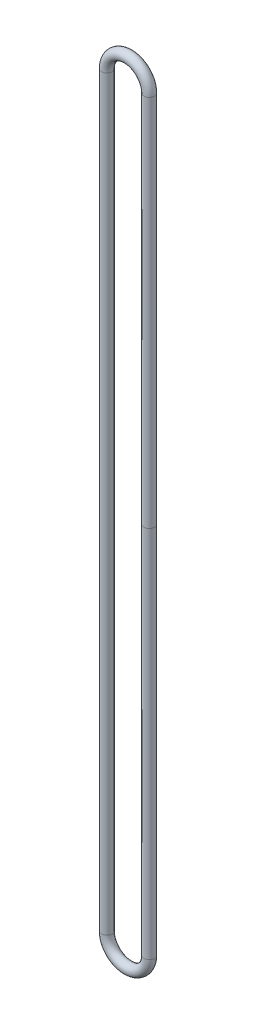
ISO-10303-21;
HEADER;
FILE_DESCRIPTION(('STEP AP214'),'2;1');
FILE_NAME('part.step','',(''),(''),'','','');
FILE_SCHEMA(('AUTOMOTIVE_DESIGN { 1 0 10303 214 1 1 1 1 }'));
ENDSEC;
DATA;
#1=APPLICATION_CONTEXT('core data for automotive mechanical design processes');
#2=APPLICATION_PROTOCOL_DEFINITION('international standard','automotive_design',2000,#1);
#3=PRODUCT_CONTEXT('',#1,'mechanical');
#4=PRODUCT('Part','Part','',(#3));
#5=PRODUCT_RELATED_PRODUCT_CATEGORY('part','',(#4));
#6=PRODUCT_DEFINITION_FORMATION('','',#4);
#7=PRODUCT_DEFINITION_CONTEXT('part definition',#1,'design');
#8=PRODUCT_DEFINITION('design','',#6,#7);
#9=PRODUCT_DEFINITION_SHAPE('','',#8);
#10=(LENGTH_UNIT() NAMED_UNIT(*) SI_UNIT(.MILLI.,.METRE.));
#11=(NAMED_UNIT(*) PLANE_ANGLE_UNIT() SI_UNIT($,.RADIAN.));
#12=(NAMED_UNIT(*) SI_UNIT($,.STERADIAN.) SOLID_ANGLE_UNIT());
#13=UNCERTAINTY_MEASURE_WITH_UNIT(LENGTH_MEASURE(1.E-05),#10,'distance_accuracy_value','');
#14=(GEOMETRIC_REPRESENTATION_CONTEXT(3) GLOBAL_UNCERTAINTY_ASSIGNED_CONTEXT((#13)) GLOBAL_UNIT_ASSIGNED_CONTEXT((#10,
#11,#12)) REPRESENTATION_CONTEXT('',''));
#15=CARTESIAN_POINT('',(0.,0.,0.));
#16=DIRECTION('',(0.,0.,1.));
#17=DIRECTION('',(1.,0.,0.));
#18=AXIS2_PLACEMENT_3D('',#15,#16,#17);
#19=CARTESIAN_POINT('',(50.0000000000002,-1761.2,0.));
#20=DIRECTION('',(0.,1.,0.));
#21=DIRECTION('',(-1.,0.,0.));
#22=AXIS2_PLACEMENT_3D('',#19,#20,#21);
#23=CYLINDRICAL_SURFACE('',#22,12.5);
#24=CARTESIAN_POINT('',(50.0000000000001,-880.6,0.));
#25=DIRECTION('',(0.,1.,0.));
#26=DIRECTION('',(0.,0.,1.));
#27=AXIS2_PLACEMENT_3D('',#24,#25,#26);
#28=CIRCLE('',#27,12.5);
#29=CARTESIAN_POINT('',(50.0000000000001,-880.6,12.5));
#30=VERTEX_POINT('',#29);
#31=EDGE_CURVE('E50',#30,#30,#28,.T.);
#32=ORIENTED_EDGE('',*,*,#31,.F.);
#33=EDGE_LOOP('',(#32));
#34=FACE_BOUND('',#33,.T.);
#35=CARTESIAN_POINT('',(50.0000000000004,-1761.2,0.));
#36=DIRECTION('',(0.,1.,0.));
#37=DIRECTION('',(0.,0.,1.));
#38=AXIS2_PLACEMENT_3D('',#35,#36,#37);
#39=CIRCLE('',#38,12.5);
#40=CARTESIAN_POINT('',(62.5000000000002,-1761.2,0.));
#41=VERTEX_POINT('',#40);
#42=EDGE_CURVE('E10',#41,#41,#39,.T.);
#43=ORIENTED_EDGE('',*,*,#42,.T.);
#44=EDGE_LOOP('',(#43));
#45=FACE_BOUND('',#44,.T.);
#46=ADVANCED_FACE('F31',(#34,#45),#23,.T.);
#47=CARTESIAN_POINT('',(2.15105711021124E-13,-1761.2,0.));
#48=DIRECTION('',(0.,0.,1.));
#49=DIRECTION('',(1.,0.,0.));
#50=AXIS2_PLACEMENT_3D('',#47,#48,#49);
#51=TOROIDAL_SURFACE('',#50,50.,12.5);
#52=CARTESIAN_POINT('',(-49.9999999999998,-1761.2,0.));
#53=DIRECTION('',(0.,-1.,0.));
#54=DIRECTION('',(0.,0.,1.));
#55=AXIS2_PLACEMENT_3D('',#52,#53,#54);
#56=CIRCLE('',#55,12.5);
#57=CARTESIAN_POINT('',(-62.4999999999998,-1761.2,0.));
#58=VERTEX_POINT('',#57);
#59=EDGE_CURVE('E37',#58,#58,#56,.T.);
#60=CARTESIAN_POINT('',(2.15105711021124E-13,-1761.2,0.));
#61=DIRECTION('',(0.,0.,1.));
#62=DIRECTION('',(1.,0.,0.));
#63=AXIS2_PLACEMENT_3D('',#60,#61,#62);
#64=CIRCLE('',#63,62.5);
#65=EDGE_CURVE('',#58,#41,#64,.T.);
#66=ORIENTED_EDGE('',*,*,#59,.T.);
#67=ORIENTED_EDGE('',*,*,#42,.F.);
#68=ORIENTED_EDGE('',*,*,#65,.T.);
#69=ORIENTED_EDGE('',*,*,#65,.F.);
#70=EDGE_LOOP('',(#66,#68,#67,#69));
#71=FACE_BOUND('',#70,.T.);
#72=ADVANCED_FACE('F57',(#71),#51,.T.);
#73=CARTESIAN_POINT('',(-50.,0.,0.));
#74=DIRECTION('',(0.,-1.,0.));
#75=DIRECTION('',(1.,0.,0.));
#76=AXIS2_PLACEMENT_3D('',#73,#74,#75);
#77=CYLINDRICAL_SURFACE('',#76,12.5);
#78=ORIENTED_EDGE('',*,*,#59,.F.);
#79=EDGE_LOOP('',(#78));
#80=FACE_BOUND('',#79,.T.);
#81=CARTESIAN_POINT('',(-50.,0.,0.));
#82=DIRECTION('',(0.,-1.,0.));
#83=DIRECTION('',(0.,0.,1.));
#84=AXIS2_PLACEMENT_3D('',#81,#82,#83);
#85=CIRCLE('',#84,12.5);
#86=CARTESIAN_POINT('',(-62.5000000000001,0.,0.));
#87=VERTEX_POINT('',#86);
#88=EDGE_CURVE('E41',#87,#87,#85,.T.);
#89=ORIENTED_EDGE('',*,*,#88,.T.);
#90=EDGE_LOOP('',(#89));
#91=FACE_BOUND('',#90,.T.);
#92=ADVANCED_FACE('F61',(#80,#91),#77,.T.);
#93=CARTESIAN_POINT('',(0.,0.,0.));
#94=DIRECTION('',(0.,0.,1.));
#95=DIRECTION('',(1.,0.,0.));
#96=AXIS2_PLACEMENT_3D('',#93,#94,#95);
#97=TOROIDAL_SURFACE('',#96,50.0000000000001,12.5);
#98=CARTESIAN_POINT('',(50.,0.,0.));
#99=DIRECTION('',(0.,1.,0.));
#100=DIRECTION('',(0.,0.,1.));
#101=AXIS2_PLACEMENT_3D('',#98,#99,#100);
#102=CIRCLE('',#101,12.5);
#103=CARTESIAN_POINT('',(62.5000000000001,0.,0.));
#104=VERTEX_POINT('',#103);
#105=EDGE_CURVE('E45',#104,#104,#102,.T.);
#106=CARTESIAN_POINT('',(0.,0.,0.));
#107=DIRECTION('',(0.,0.,1.));
#108=DIRECTION('',(1.,0.,0.));
#109=AXIS2_PLACEMENT_3D('',#106,#107,#108);
#110=CIRCLE('',#109,62.5000000000001);
#111=EDGE_CURVE('',#104,#87,#110,.T.);
#112=ORIENTED_EDGE('',*,*,#105,.T.);
#113=ORIENTED_EDGE('',*,*,#88,.F.);
#114=ORIENTED_EDGE('',*,*,#111,.T.);
#115=ORIENTED_EDGE('',*,*,#111,.F.);
#116=EDGE_LOOP('',(#112,#114,#113,#115));
#117=FACE_BOUND('',#116,.T.);
#118=ADVANCED_FACE('F66',(#117),#97,.T.);
#119=CARTESIAN_POINT('',(50.0000000000001,-880.6,0.));
#120=DIRECTION('',(0.,1.,0.));
#121=DIRECTION('',(-1.,0.,0.));
#122=AXIS2_PLACEMENT_3D('',#119,#120,#121);
#123=CYLINDRICAL_SURFACE('',#122,12.5);
#124=ORIENTED_EDGE('',*,*,#105,.F.);
#125=EDGE_LOOP('',(#124));
#126=FACE_BOUND('',#125,.T.);
#127=ORIENTED_EDGE('',*,*,#31,.T.);
#128=EDGE_LOOP('',(#127));
#129=FACE_BOUND('',#128,.T.);
#130=ADVANCED_FACE('F54',(#126,#129),#123,.T.);
#131=CLOSED_SHELL('',(#46,#72,#92,#118,#130));
#132=MANIFOLD_SOLID_BREP('B2',#131);
#133=ADVANCED_BREP_SHAPE_REPRESENTATION('',(#18,#132),#14);
#134=SHAPE_DEFINITION_REPRESENTATION(#9,#133);
ENDSEC;
END-ISO-10303-21;
